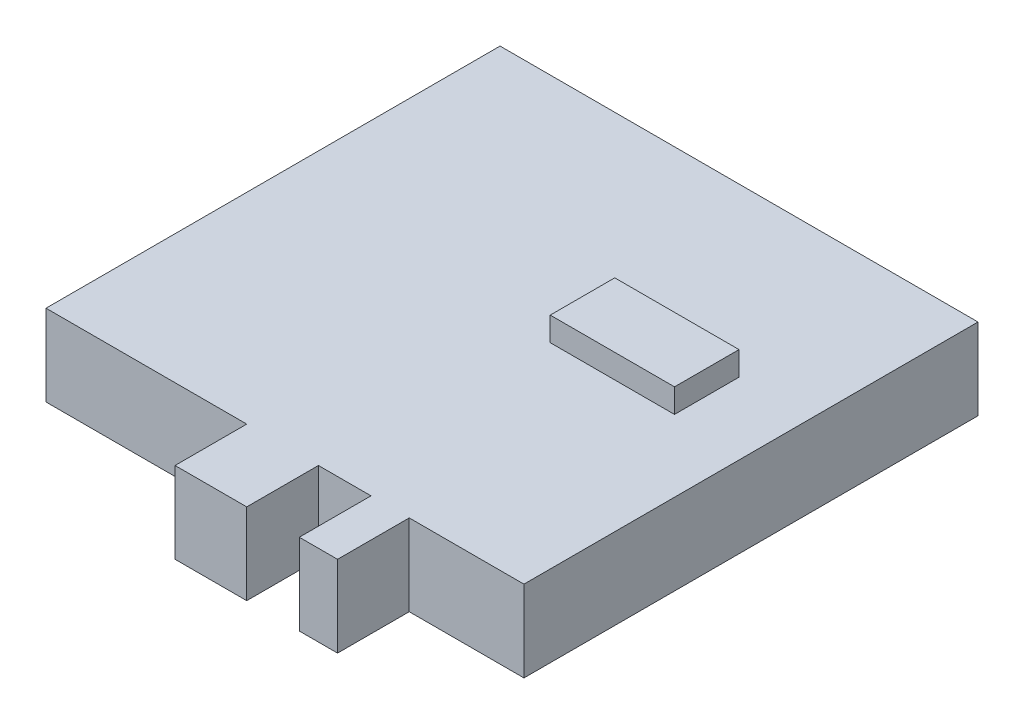
ISO-10303-21;
HEADER;
FILE_DESCRIPTION(('STEP AP214'),'2;1');
FILE_NAME('part.step','',(''),(''),'','','');
FILE_SCHEMA(('AUTOMOTIVE_DESIGN { 1 0 10303 214 1 1 1 1 }'));
ENDSEC;
DATA;
#1=APPLICATION_CONTEXT('core data for automotive mechanical design processes');
#2=APPLICATION_PROTOCOL_DEFINITION('international standard','automotive_design',2000,#1);
#3=PRODUCT_CONTEXT('',#1,'mechanical');
#4=PRODUCT('Part','Part','',(#3));
#5=PRODUCT_RELATED_PRODUCT_CATEGORY('part','',(#4));
#6=PRODUCT_DEFINITION_FORMATION('','',#4);
#7=PRODUCT_DEFINITION_CONTEXT('part definition',#1,'design');
#8=PRODUCT_DEFINITION('design','',#6,#7);
#9=PRODUCT_DEFINITION_SHAPE('','',#8);
#10=(LENGTH_UNIT() NAMED_UNIT(*) SI_UNIT(.MILLI.,.METRE.));
#11=(NAMED_UNIT(*) PLANE_ANGLE_UNIT() SI_UNIT($,.RADIAN.));
#12=(NAMED_UNIT(*) SI_UNIT($,.STERADIAN.) SOLID_ANGLE_UNIT());
#13=UNCERTAINTY_MEASURE_WITH_UNIT(LENGTH_MEASURE(1.E-05),#10,'distance_accuracy_value','');
#14=(GEOMETRIC_REPRESENTATION_CONTEXT(3) GLOBAL_UNCERTAINTY_ASSIGNED_CONTEXT((#13)) GLOBAL_UNIT_ASSIGNED_CONTEXT((#10,
#11,#12)) REPRESENTATION_CONTEXT('',''));
#15=CARTESIAN_POINT('',(0.,0.,0.));
#16=DIRECTION('',(0.,0.,1.));
#17=DIRECTION('',(1.,0.,0.));
#18=AXIS2_PLACEMENT_3D('',#15,#16,#17);
#19=CARTESIAN_POINT('',(0.,17.,0.));
#20=DIRECTION('',(0.,1.,0.));
#21=DIRECTION('',(0.,0.,1.));
#22=AXIS2_PLACEMENT_3D('',#19,#20,#21);
#23=PLANE('',#22);
#24=DIRECTION('',(0.,0.,1.));
#25=VECTOR('',#24,1.);
#26=CARTESIAN_POINT('',(43.9314666270869,17.,0.));
#27=LINE('',#26,#25);
#28=CARTESIAN_POINT('',(43.9314666270869,17.,43.414977660434));
#29=VERTEX_POINT('',#28);
#30=CARTESIAN_POINT('',(43.931466627087,17.,58.414977660434));
#31=VERTEX_POINT('',#30);
#32=EDGE_CURVE('E273',#29,#31,#27,.T.);
#33=ORIENTED_EDGE('',*,*,#32,.F.);
#34=DIRECTION('',(1.,0.,0.));
#35=VECTOR('',#34,1.);
#36=CARTESIAN_POINT('',(0.,17.,43.414977660434));
#37=LINE('',#36,#35);
#38=CARTESIAN_POINT('',(67.9314666270869,17.,43.414977660434));
#39=VERTEX_POINT('',#38);
#40=EDGE_CURVE('E290',#29,#39,#37,.T.);
#41=ORIENTED_EDGE('',*,*,#40,.T.);
#42=DIRECTION('',(0.,0.,1.));
#43=VECTOR('',#42,1.);
#44=CARTESIAN_POINT('',(67.9314666270869,17.,0.));
#45=LINE('',#44,#43);
#46=CARTESIAN_POINT('',(67.9314666270869,17.,-51.585022339566));
#47=VERTEX_POINT('',#46);
#48=EDGE_CURVE('E237',#47,#39,#45,.T.);
#49=ORIENTED_EDGE('',*,*,#48,.F.);
#50=DIRECTION('',(1.,0.,0.));
#51=VECTOR('',#50,1.);
#52=CARTESIAN_POINT('',(0.,17.,-51.585022339566));
#53=LINE('',#52,#51);
#54=CARTESIAN_POINT('',(-32.0685333729131,17.,-51.585022339566));
#55=VERTEX_POINT('',#54);
#56=EDGE_CURVE('E293',#55,#47,#53,.T.);
#57=ORIENTED_EDGE('',*,*,#56,.F.);
#58=DIRECTION('',(0.,0.,1.));
#59=VECTOR('',#58,1.);
#60=CARTESIAN_POINT('',(-32.0685333729131,17.,0.));
#61=LINE('',#60,#59);
#62=CARTESIAN_POINT('',(-32.0685333729131,17.,43.414977660434));
#63=VERTEX_POINT('',#62);
#64=EDGE_CURVE('E296',#55,#63,#61,.T.);
#65=ORIENTED_EDGE('',*,*,#64,.T.);
#66=DIRECTION('',(1.,0.,0.));
#67=VECTOR('',#66,1.);
#68=CARTESIAN_POINT('',(0.,17.,43.414977660434));
#69=LINE('',#68,#67);
#70=CARTESIAN_POINT('',(9.93146662708694,17.,43.414977660434));
#71=VERTEX_POINT('',#70);
#72=EDGE_CURVE('E299',#63,#71,#69,.T.);
#73=ORIENTED_EDGE('',*,*,#72,.T.);
#74=DIRECTION('',(0.,0.,1.));
#75=VECTOR('',#74,1.);
#76=CARTESIAN_POINT('',(9.93146662708694,17.,0.));
#77=LINE('',#76,#75);
#78=CARTESIAN_POINT('',(9.93146662708694,17.,58.414977660434));
#79=VERTEX_POINT('',#78);
#80=EDGE_CURVE('E302',#71,#79,#77,.T.);
#81=ORIENTED_EDGE('',*,*,#80,.T.);
#82=DIRECTION('',(1.,0.,0.));
#83=VECTOR('',#82,1.);
#84=CARTESIAN_POINT('',(0.,17.,58.414977660434));
#85=LINE('',#84,#83);
#86=CARTESIAN_POINT('',(24.9314666270869,17.,58.414977660434));
#87=VERTEX_POINT('',#86);
#88=EDGE_CURVE('E305',#79,#87,#85,.T.);
#89=ORIENTED_EDGE('',*,*,#88,.T.);
#90=DIRECTION('',(0.,0.,1.));
#91=VECTOR('',#90,1.);
#92=CARTESIAN_POINT('',(24.9314666270869,17.,0.));
#93=LINE('',#92,#91);
#94=CARTESIAN_POINT('',(24.9314666270869,17.,43.414977660434));
#95=VERTEX_POINT('',#94);
#96=EDGE_CURVE('E201',#95,#87,#93,.T.);
#97=ORIENTED_EDGE('',*,*,#96,.F.);
#98=DIRECTION('',(1.,0.,0.));
#99=VECTOR('',#98,1.);
#100=CARTESIAN_POINT('',(0.,17.,43.414977660434));
#101=LINE('',#100,#99);
#102=CARTESIAN_POINT('',(35.931466627087,17.,43.414977660434));
#103=VERTEX_POINT('',#102);
#104=EDGE_CURVE('E194',#95,#103,#101,.T.);
#105=ORIENTED_EDGE('',*,*,#104,.T.);
#106=DIRECTION('',(0.,0.,1.));
#107=VECTOR('',#106,1.);
#108=CARTESIAN_POINT('',(35.931466627087,17.,0.));
#109=LINE('',#108,#107);
#110=CARTESIAN_POINT('',(35.931466627087,17.,58.414977660434));
#111=VERTEX_POINT('',#110);
#112=EDGE_CURVE('E183',#103,#111,#109,.T.);
#113=ORIENTED_EDGE('',*,*,#112,.T.);
#114=DIRECTION('',(-1.,0.,0.));
#115=VECTOR('',#114,1.);
#116=CARTESIAN_POINT('',(0.,17.,58.414977660434));
#117=LINE('',#116,#115);
#118=EDGE_CURVE('E193',#31,#111,#117,.T.);
#119=ORIENTED_EDGE('',*,*,#118,.F.);
#120=EDGE_LOOP('',(#33,#41,#49,#57,#65,#73,#81,#89,#97,#105,#113,#119));
#121=FACE_BOUND('',#120,.T.);
#122=DIRECTION('',(1.,0.,0.));
#123=VECTOR('',#122,1.);
#124=CARTESIAN_POINT('',(26.9314666270869,17.,-3.08502233956596));
#125=LINE('',#124,#123);
#126=CARTESIAN_POINT('',(26.9314666270869,17.,-3.08502233956596));
#127=VERTEX_POINT('',#126);
#128=CARTESIAN_POINT('',(52.9314666270869,17.,-3.08502233956596));
#129=VERTEX_POINT('',#128);
#130=EDGE_CURVE('E349',#127,#129,#125,.T.);
#131=ORIENTED_EDGE('',*,*,#130,.F.);
#132=DIRECTION('',(0.,0.,1.));
#133=VECTOR('',#132,1.);
#134=CARTESIAN_POINT('',(26.9314666270869,17.,-16.585022339566));
#135=LINE('',#134,#133);
#136=CARTESIAN_POINT('',(26.9314666270869,17.,-16.585022339566));
#137=VERTEX_POINT('',#136);
#138=EDGE_CURVE('E340',#137,#127,#135,.T.);
#139=ORIENTED_EDGE('',*,*,#138,.F.);
#140=DIRECTION('',(-1.,0.,0.));
#141=VECTOR('',#140,1.);
#142=CARTESIAN_POINT('',(26.9314666270869,17.,-16.585022339566));
#143=LINE('',#142,#141);
#144=CARTESIAN_POINT('',(52.9314666270869,17.,-16.585022339566));
#145=VERTEX_POINT('',#144);
#146=EDGE_CURVE('E355',#145,#137,#143,.T.);
#147=ORIENTED_EDGE('',*,*,#146,.F.);
#148=DIRECTION('',(0.,0.,-1.));
#149=VECTOR('',#148,1.);
#150=CARTESIAN_POINT('',(52.9314666270869,17.,-16.585022339566));
#151=LINE('',#150,#149);
#152=EDGE_CURVE('E352',#129,#145,#151,.T.);
#153=ORIENTED_EDGE('',*,*,#152,.F.);
#154=EDGE_LOOP('',(#131,#139,#147,#153));
#155=FACE_BOUND('',#154,.T.);
#156=ADVANCED_FACE('F81',(#121,#155),#23,.T.);
#157=CARTESIAN_POINT('',(0.,17.,43.414977660434));
#158=DIRECTION('',(0.,0.,-1.));
#159=DIRECTION('',(-1.,0.,0.));
#160=AXIS2_PLACEMENT_3D('',#157,#158,#159);
#161=PLANE('',#160);
#162=DIRECTION('',(1.,0.,0.));
#163=VECTOR('',#162,1.);
#164=CARTESIAN_POINT('',(0.,0.,43.414977660434));
#165=LINE('',#164,#163);
#166=CARTESIAN_POINT('',(43.9314666270869,0.,43.414977660434));
#167=VERTEX_POINT('',#166);
#168=CARTESIAN_POINT('',(67.9314666270869,0.,43.414977660434));
#169=VERTEX_POINT('',#168);
#170=EDGE_CURVE('E240',#167,#169,#165,.T.);
#171=ORIENTED_EDGE('',*,*,#170,.T.);
#172=DIRECTION('',(0.,-1.,0.));
#173=VECTOR('',#172,1.);
#174=CARTESIAN_POINT('',(67.9314666270869,17.,43.414977660434));
#175=LINE('',#174,#173);
#176=EDGE_CURVE('E89',#39,#169,#175,.T.);
#177=ORIENTED_EDGE('',*,*,#176,.F.);
#178=ORIENTED_EDGE('',*,*,#40,.F.);
#179=DIRECTION('',(0.,-1.,0.));
#180=VECTOR('',#179,1.);
#181=CARTESIAN_POINT('',(43.9314666270869,17.,43.414977660434));
#182=LINE('',#181,#180);
#183=EDGE_CURVE('E12',#29,#167,#182,.T.);
#184=ORIENTED_EDGE('',*,*,#183,.T.);
#185=EDGE_LOOP('',(#171,#177,#178,#184));
#186=FACE_BOUND('',#185,.T.);
#187=ADVANCED_FACE('F241',(#186),#161,.F.);
#188=CARTESIAN_POINT('',(67.9314666270869,17.,0.));
#189=DIRECTION('',(1.,0.,0.));
#190=DIRECTION('',(0.,0.,-1.));
#191=AXIS2_PLACEMENT_3D('',#188,#189,#190);
#192=PLANE('',#191);
#193=DIRECTION('',(0.,0.,1.));
#194=VECTOR('',#193,1.);
#195=CARTESIAN_POINT('',(67.9314666270869,0.,0.));
#196=LINE('',#195,#194);
#197=CARTESIAN_POINT('',(67.9314666270869,0.,-51.585022339566));
#198=VERTEX_POINT('',#197);
#199=EDGE_CURVE('E234',#198,#169,#196,.T.);
#200=ORIENTED_EDGE('',*,*,#199,.F.);
#201=DIRECTION('',(0.,-1.,0.));
#202=VECTOR('',#201,1.);
#203=CARTESIAN_POINT('',(67.9314666270869,17.,-51.585022339566));
#204=LINE('',#203,#202);
#205=EDGE_CURVE('E226',#47,#198,#204,.T.);
#206=ORIENTED_EDGE('',*,*,#205,.F.);
#207=ORIENTED_EDGE('',*,*,#48,.T.);
#208=ORIENTED_EDGE('',*,*,#176,.T.);
#209=EDGE_LOOP('',(#200,#206,#207,#208));
#210=FACE_BOUND('',#209,.T.);
#211=ADVANCED_FACE('F232',(#210),#192,.T.);
#212=CARTESIAN_POINT('',(0.,17.,-51.585022339566));
#213=DIRECTION('',(0.,0.,-1.));
#214=DIRECTION('',(-1.,0.,0.));
#215=AXIS2_PLACEMENT_3D('',#212,#213,#214);
#216=PLANE('',#215);
#217=DIRECTION('',(1.,0.,0.));
#218=VECTOR('',#217,1.);
#219=CARTESIAN_POINT('',(0.,0.,-51.585022339566));
#220=LINE('',#219,#218);
#221=CARTESIAN_POINT('',(-32.0685333729131,0.,-51.585022339566));
#222=VERTEX_POINT('',#221);
#223=EDGE_CURVE('E248',#222,#198,#220,.T.);
#224=ORIENTED_EDGE('',*,*,#223,.F.);
#225=DIRECTION('',(0.,-1.,0.));
#226=VECTOR('',#225,1.);
#227=CARTESIAN_POINT('',(-32.0685333729131,17.,-51.585022339566));
#228=LINE('',#227,#226);
#229=EDGE_CURVE('E224',#55,#222,#228,.T.);
#230=ORIENTED_EDGE('',*,*,#229,.F.);
#231=ORIENTED_EDGE('',*,*,#56,.T.);
#232=ORIENTED_EDGE('',*,*,#205,.T.);
#233=EDGE_LOOP('',(#224,#230,#231,#232));
#234=FACE_BOUND('',#233,.T.);
#235=ADVANCED_FACE('F480',(#234),#216,.T.);
#236=CARTESIAN_POINT('',(-32.0685333729131,17.,0.));
#237=DIRECTION('',(1.,0.,0.));
#238=DIRECTION('',(0.,0.,-1.));
#239=AXIS2_PLACEMENT_3D('',#236,#237,#238);
#240=PLANE('',#239);
#241=DIRECTION('',(0.,0.,1.));
#242=VECTOR('',#241,1.);
#243=CARTESIAN_POINT('',(-32.0685333729131,0.,0.));
#244=LINE('',#243,#242);
#245=CARTESIAN_POINT('',(-32.0685333729131,0.,43.414977660434));
#246=VERTEX_POINT('',#245);
#247=EDGE_CURVE('E250',#222,#246,#244,.T.);
#248=ORIENTED_EDGE('',*,*,#247,.T.);
#249=DIRECTION('',(0.,-1.,0.));
#250=VECTOR('',#249,1.);
#251=CARTESIAN_POINT('',(-32.0685333729131,17.,43.414977660434));
#252=LINE('',#251,#250);
#253=EDGE_CURVE('E221',#63,#246,#252,.T.);
#254=ORIENTED_EDGE('',*,*,#253,.F.);
#255=ORIENTED_EDGE('',*,*,#64,.F.);
#256=ORIENTED_EDGE('',*,*,#229,.T.);
#257=EDGE_LOOP('',(#248,#254,#255,#256));
#258=FACE_BOUND('',#257,.T.);
#259=ADVANCED_FACE('F470',(#258),#240,.F.);
#260=CARTESIAN_POINT('',(0.,17.,43.414977660434));
#261=DIRECTION('',(0.,0.,-1.));
#262=DIRECTION('',(-1.,0.,0.));
#263=AXIS2_PLACEMENT_3D('',#260,#261,#262);
#264=PLANE('',#263);
#265=DIRECTION('',(1.,0.,0.));
#266=VECTOR('',#265,1.);
#267=CARTESIAN_POINT('',(0.,0.,43.414977660434));
#268=LINE('',#267,#266);
#269=CARTESIAN_POINT('',(9.93146662708694,0.,43.414977660434));
#270=VERTEX_POINT('',#269);
#271=EDGE_CURVE('E256',#246,#270,#268,.T.);
#272=ORIENTED_EDGE('',*,*,#271,.T.);
#273=DIRECTION('',(0.,-1.,0.));
#274=VECTOR('',#273,1.);
#275=CARTESIAN_POINT('',(9.93146662708694,17.,43.414977660434));
#276=LINE('',#275,#274);
#277=EDGE_CURVE('E218',#71,#270,#276,.T.);
#278=ORIENTED_EDGE('',*,*,#277,.F.);
#279=ORIENTED_EDGE('',*,*,#72,.F.);
#280=ORIENTED_EDGE('',*,*,#253,.T.);
#281=EDGE_LOOP('',(#272,#278,#279,#280));
#282=FACE_BOUND('',#281,.T.);
#283=ADVANCED_FACE('F460',(#282),#264,.F.);
#284=CARTESIAN_POINT('',(9.93146662708694,17.,0.));
#285=DIRECTION('',(1.,0.,0.));
#286=DIRECTION('',(0.,0.,-1.));
#287=AXIS2_PLACEMENT_3D('',#284,#285,#286);
#288=PLANE('',#287);
#289=DIRECTION('',(0.,0.,1.));
#290=VECTOR('',#289,1.);
#291=CARTESIAN_POINT('',(9.93146662708694,0.,0.));
#292=LINE('',#291,#290);
#293=CARTESIAN_POINT('',(9.93146662708694,0.,58.414977660434));
#294=VERTEX_POINT('',#293);
#295=EDGE_CURVE('E259',#270,#294,#292,.T.);
#296=ORIENTED_EDGE('',*,*,#295,.T.);
#297=DIRECTION('',(0.,-1.,0.));
#298=VECTOR('',#297,1.);
#299=CARTESIAN_POINT('',(9.93146662708694,17.,58.414977660434));
#300=LINE('',#299,#298);
#301=EDGE_CURVE('E215',#79,#294,#300,.T.);
#302=ORIENTED_EDGE('',*,*,#301,.F.);
#303=ORIENTED_EDGE('',*,*,#80,.F.);
#304=ORIENTED_EDGE('',*,*,#277,.T.);
#305=EDGE_LOOP('',(#296,#302,#303,#304));
#306=FACE_BOUND('',#305,.T.);
#307=ADVANCED_FACE('F450',(#306),#288,.F.);
#308=CARTESIAN_POINT('',(0.,17.,58.414977660434));
#309=DIRECTION('',(0.,0.,-1.));
#310=DIRECTION('',(-1.,0.,0.));
#311=AXIS2_PLACEMENT_3D('',#308,#309,#310);
#312=PLANE('',#311);
#313=DIRECTION('',(1.,0.,0.));
#314=VECTOR('',#313,1.);
#315=CARTESIAN_POINT('',(0.,0.,58.414977660434));
#316=LINE('',#315,#314);
#317=CARTESIAN_POINT('',(24.9314666270869,0.,58.414977660434));
#318=VERTEX_POINT('',#317);
#319=EDGE_CURVE('E262',#294,#318,#316,.T.);
#320=ORIENTED_EDGE('',*,*,#319,.T.);
#321=DIRECTION('',(0.,-1.,0.));
#322=VECTOR('',#321,1.);
#323=CARTESIAN_POINT('',(24.9314666270869,17.,58.414977660434));
#324=LINE('',#323,#322);
#325=EDGE_CURVE('E209',#87,#318,#324,.T.);
#326=ORIENTED_EDGE('',*,*,#325,.F.);
#327=ORIENTED_EDGE('',*,*,#88,.F.);
#328=ORIENTED_EDGE('',*,*,#301,.T.);
#329=EDGE_LOOP('',(#320,#326,#327,#328));
#330=FACE_BOUND('',#329,.T.);
#331=ADVANCED_FACE('F441',(#330),#312,.F.);
#332=CARTESIAN_POINT('',(24.9314666270869,17.,0.));
#333=DIRECTION('',(1.,0.,0.));
#334=DIRECTION('',(0.,0.,-1.));
#335=AXIS2_PLACEMENT_3D('',#332,#333,#334);
#336=PLANE('',#335);
#337=DIRECTION('',(0.,0.,1.));
#338=VECTOR('',#337,1.);
#339=CARTESIAN_POINT('',(24.9314666270869,0.,0.));
#340=LINE('',#339,#338);
#341=CARTESIAN_POINT('',(24.9314666270869,0.,43.414977660434));
#342=VERTEX_POINT('',#341);
#343=EDGE_CURVE('E265',#342,#318,#340,.T.);
#344=ORIENTED_EDGE('',*,*,#343,.F.);
#345=DIRECTION('',(0.,-1.,0.));
#346=VECTOR('',#345,1.);
#347=CARTESIAN_POINT('',(24.9314666270869,17.,43.414977660434));
#348=LINE('',#347,#346);
#349=EDGE_CURVE('E207',#95,#342,#348,.T.);
#350=ORIENTED_EDGE('',*,*,#349,.F.);
#351=ORIENTED_EDGE('',*,*,#96,.T.);
#352=ORIENTED_EDGE('',*,*,#325,.T.);
#353=EDGE_LOOP('',(#344,#350,#351,#352));
#354=FACE_BOUND('',#353,.T.);
#355=ADVANCED_FACE('F309',(#354),#336,.T.);
#356=CARTESIAN_POINT('',(0.,17.,43.414977660434));
#357=DIRECTION('',(0.,0.,-1.));
#358=DIRECTION('',(-1.,0.,0.));
#359=AXIS2_PLACEMENT_3D('',#356,#357,#358);
#360=PLANE('',#359);
#361=DIRECTION('',(1.,0.,0.));
#362=VECTOR('',#361,1.);
#363=CARTESIAN_POINT('',(0.,0.,43.414977660434));
#364=LINE('',#363,#362);
#365=CARTESIAN_POINT('',(35.931466627087,0.,43.414977660434));
#366=VERTEX_POINT('',#365);
#367=EDGE_CURVE('E206',#342,#366,#364,.T.);
#368=ORIENTED_EDGE('',*,*,#367,.T.);
#369=DIRECTION('',(0.,-1.,0.));
#370=VECTOR('',#369,1.);
#371=CARTESIAN_POINT('',(35.931466627087,17.,43.414977660434));
#372=LINE('',#371,#370);
#373=EDGE_CURVE('E188',#103,#366,#372,.T.);
#374=ORIENTED_EDGE('',*,*,#373,.F.);
#375=ORIENTED_EDGE('',*,*,#104,.F.);
#376=ORIENTED_EDGE('',*,*,#349,.T.);
#377=EDGE_LOOP('',(#368,#374,#375,#376));
#378=FACE_BOUND('',#377,.T.);
#379=ADVANCED_FACE('F204',(#378),#360,.F.);
#380=CARTESIAN_POINT('',(35.931466627087,17.,0.));
#381=DIRECTION('',(1.,0.,0.));
#382=DIRECTION('',(0.,0.,-1.));
#383=AXIS2_PLACEMENT_3D('',#380,#381,#382);
#384=PLANE('',#383);
#385=DIRECTION('',(0.,0.,1.));
#386=VECTOR('',#385,1.);
#387=CARTESIAN_POINT('',(35.931466627087,0.,0.));
#388=LINE('',#387,#386);
#389=CARTESIAN_POINT('',(35.931466627087,0.,58.414977660434));
#390=VERTEX_POINT('',#389);
#391=EDGE_CURVE('E269',#366,#390,#388,.T.);
#392=ORIENTED_EDGE('',*,*,#391,.T.);
#393=DIRECTION('',(0.,-1.,0.));
#394=VECTOR('',#393,1.);
#395=CARTESIAN_POINT('',(35.931466627087,17.,58.414977660434));
#396=LINE('',#395,#394);
#397=EDGE_CURVE('E190',#111,#390,#396,.T.);
#398=ORIENTED_EDGE('',*,*,#397,.F.);
#399=ORIENTED_EDGE('',*,*,#112,.F.);
#400=ORIENTED_EDGE('',*,*,#373,.T.);
#401=EDGE_LOOP('',(#392,#398,#399,#400));
#402=FACE_BOUND('',#401,.T.);
#403=ADVANCED_FACE('F186',(#402),#384,.F.);
#404=CARTESIAN_POINT('',(0.,17.,58.414977660434));
#405=DIRECTION('',(0.,0.,1.));
#406=DIRECTION('',(1.,0.,0.));
#407=AXIS2_PLACEMENT_3D('',#404,#405,#406);
#408=PLANE('',#407);
#409=DIRECTION('',(-1.,0.,0.));
#410=VECTOR('',#409,1.);
#411=CARTESIAN_POINT('',(0.,0.,58.414977660434));
#412=LINE('',#411,#410);
#413=CARTESIAN_POINT('',(43.931466627087,0.,58.414977660434));
#414=VERTEX_POINT('',#413);
#415=EDGE_CURVE('E271',#414,#390,#412,.T.);
#416=ORIENTED_EDGE('',*,*,#415,.F.);
#417=DIRECTION('',(0.,-1.,0.));
#418=VECTOR('',#417,1.);
#419=CARTESIAN_POINT('',(43.931466627087,17.,58.414977660434));
#420=LINE('',#419,#418);
#421=EDGE_CURVE('E105',#31,#414,#420,.T.);
#422=ORIENTED_EDGE('',*,*,#421,.F.);
#423=ORIENTED_EDGE('',*,*,#118,.T.);
#424=ORIENTED_EDGE('',*,*,#397,.T.);
#425=EDGE_LOOP('',(#416,#422,#423,#424));
#426=FACE_BOUND('',#425,.T.);
#427=ADVANCED_FACE('F311',(#426),#408,.T.);
#428=CARTESIAN_POINT('',(43.9314666270869,17.,0.));
#429=DIRECTION('',(1.,0.,0.));
#430=DIRECTION('',(0.,0.,-1.));
#431=AXIS2_PLACEMENT_3D('',#428,#429,#430);
#432=PLANE('',#431);
#433=DIRECTION('',(0.,0.,1.));
#434=VECTOR('',#433,1.);
#435=CARTESIAN_POINT('',(43.9314666270869,0.,0.));
#436=LINE('',#435,#434);
#437=EDGE_CURVE('E243',#167,#414,#436,.T.);
#438=ORIENTED_EDGE('',*,*,#437,.F.);
#439=ORIENTED_EDGE('',*,*,#183,.F.);
#440=ORIENTED_EDGE('',*,*,#32,.T.);
#441=ORIENTED_EDGE('',*,*,#421,.T.);
#442=EDGE_LOOP('',(#438,#439,#440,#441));
#443=FACE_BOUND('',#442,.T.);
#444=ADVANCED_FACE('F83',(#443),#432,.T.);
#445=CARTESIAN_POINT('',(0.,0.,0.));
#446=DIRECTION('',(0.,1.,0.));
#447=DIRECTION('',(0.,0.,1.));
#448=AXIS2_PLACEMENT_3D('',#445,#446,#447);
#449=PLANE('',#448);
#450=ORIENTED_EDGE('',*,*,#437,.T.);
#451=ORIENTED_EDGE('',*,*,#415,.T.);
#452=ORIENTED_EDGE('',*,*,#391,.F.);
#453=ORIENTED_EDGE('',*,*,#367,.F.);
#454=ORIENTED_EDGE('',*,*,#343,.T.);
#455=ORIENTED_EDGE('',*,*,#319,.F.);
#456=ORIENTED_EDGE('',*,*,#295,.F.);
#457=ORIENTED_EDGE('',*,*,#271,.F.);
#458=ORIENTED_EDGE('',*,*,#247,.F.);
#459=ORIENTED_EDGE('',*,*,#223,.T.);
#460=ORIENTED_EDGE('',*,*,#199,.T.);
#461=ORIENTED_EDGE('',*,*,#170,.F.);
#462=EDGE_LOOP('',(#450,#451,#452,#453,#454,#455,#456,#457,#458,#459,#460,#461));
#463=FACE_BOUND('',#462,.T.);
#464=ADVANCED_FACE('F245',(#463),#449,.F.);
#465=CARTESIAN_POINT('',(26.9314666270869,22.,-16.585022339566));
#466=DIRECTION('',(1.,0.,0.));
#467=DIRECTION('',(0.,0.,-1.));
#468=AXIS2_PLACEMENT_3D('',#465,#466,#467);
#469=PLANE('',#468);
#470=ORIENTED_EDGE('',*,*,#138,.T.);
#471=DIRECTION('',(0.,-1.,0.));
#472=VECTOR('',#471,1.);
#473=CARTESIAN_POINT('',(26.9314666270869,22.,-3.08502233956596));
#474=LINE('',#473,#472);
#475=CARTESIAN_POINT('',(26.9314666270869,22.,-3.08502233956596));
#476=VERTEX_POINT('',#475);
#477=EDGE_CURVE('E275',#476,#127,#474,.T.);
#478=ORIENTED_EDGE('',*,*,#477,.F.);
#479=DIRECTION('',(0.,0.,1.));
#480=VECTOR('',#479,1.);
#481=CARTESIAN_POINT('',(26.9314666270869,22.,-16.585022339566));
#482=LINE('',#481,#480);
#483=CARTESIAN_POINT('',(26.9314666270869,22.,-16.585022339566));
#484=VERTEX_POINT('',#483);
#485=EDGE_CURVE('E360',#484,#476,#482,.T.);
#486=ORIENTED_EDGE('',*,*,#485,.F.);
#487=DIRECTION('',(0.,-1.,0.));
#488=VECTOR('',#487,1.);
#489=CARTESIAN_POINT('',(26.9314666270869,22.,-16.585022339566));
#490=LINE('',#489,#488);
#491=EDGE_CURVE('E345',#484,#137,#490,.T.);
#492=ORIENTED_EDGE('',*,*,#491,.T.);
#493=EDGE_LOOP('',(#470,#478,#486,#492));
#494=FACE_BOUND('',#493,.T.);
#495=ADVANCED_FACE('F326',(#494),#469,.F.);
#496=CARTESIAN_POINT('',(26.9314666270869,22.,-3.08502233956596));
#497=DIRECTION('',(0.,0.,-1.));
#498=DIRECTION('',(-1.,0.,0.));
#499=AXIS2_PLACEMENT_3D('',#496,#497,#498);
#500=PLANE('',#499);
#501=ORIENTED_EDGE('',*,*,#130,.T.);
#502=DIRECTION('',(0.,-1.,0.));
#503=VECTOR('',#502,1.);
#504=CARTESIAN_POINT('',(52.9314666270869,22.,-3.08502233956596));
#505=LINE('',#504,#503);
#506=CARTESIAN_POINT('',(52.9314666270869,22.,-3.08502233956596));
#507=VERTEX_POINT('',#506);
#508=EDGE_CURVE('E277',#507,#129,#505,.T.);
#509=ORIENTED_EDGE('',*,*,#508,.F.);
#510=DIRECTION('',(1.,0.,0.));
#511=VECTOR('',#510,1.);
#512=CARTESIAN_POINT('',(26.9314666270869,22.,-3.08502233956596));
#513=LINE('',#512,#511);
#514=EDGE_CURVE('E367',#476,#507,#513,.T.);
#515=ORIENTED_EDGE('',*,*,#514,.F.);
#516=ORIENTED_EDGE('',*,*,#477,.T.);
#517=EDGE_LOOP('',(#501,#509,#515,#516));
#518=FACE_BOUND('',#517,.T.);
#519=ADVANCED_FACE('F332',(#518),#500,.F.);
#520=CARTESIAN_POINT('',(52.9314666270869,22.,-16.585022339566));
#521=DIRECTION('',(-1.,0.,0.));
#522=DIRECTION('',(0.,0.,1.));
#523=AXIS2_PLACEMENT_3D('',#520,#521,#522);
#524=PLANE('',#523);
#525=ORIENTED_EDGE('',*,*,#152,.T.);
#526=DIRECTION('',(0.,-1.,0.));
#527=VECTOR('',#526,1.);
#528=CARTESIAN_POINT('',(52.9314666270869,22.,-16.585022339566));
#529=LINE('',#528,#527);
#530=CARTESIAN_POINT('',(52.9314666270869,22.,-16.585022339566));
#531=VERTEX_POINT('',#530);
#532=EDGE_CURVE('E96',#531,#145,#529,.T.);
#533=ORIENTED_EDGE('',*,*,#532,.F.);
#534=DIRECTION('',(0.,0.,-1.));
#535=VECTOR('',#534,1.);
#536=CARTESIAN_POINT('',(52.9314666270869,22.,-16.585022339566));
#537=LINE('',#536,#535);
#538=EDGE_CURVE('E363',#507,#531,#537,.T.);
#539=ORIENTED_EDGE('',*,*,#538,.F.);
#540=ORIENTED_EDGE('',*,*,#508,.T.);
#541=EDGE_LOOP('',(#525,#533,#539,#540));
#542=FACE_BOUND('',#541,.T.);
#543=ADVANCED_FACE('F337',(#542),#524,.F.);
#544=CARTESIAN_POINT('',(26.9314666270869,22.,-16.585022339566));
#545=DIRECTION('',(0.,0.,1.));
#546=DIRECTION('',(1.,0.,0.));
#547=AXIS2_PLACEMENT_3D('',#544,#545,#546);
#548=PLANE('',#547);
#549=ORIENTED_EDGE('',*,*,#146,.T.);
#550=ORIENTED_EDGE('',*,*,#491,.F.);
#551=DIRECTION('',(-1.,0.,0.));
#552=VECTOR('',#551,1.);
#553=CARTESIAN_POINT('',(26.9314666270869,22.,-16.585022339566));
#554=LINE('',#553,#552);
#555=EDGE_CURVE('E361',#531,#484,#554,.T.);
#556=ORIENTED_EDGE('',*,*,#555,.F.);
#557=ORIENTED_EDGE('',*,*,#532,.T.);
#558=EDGE_LOOP('',(#549,#550,#556,#557));
#559=FACE_BOUND('',#558,.T.);
#560=ADVANCED_FACE('F379',(#559),#548,.F.);
#561=CARTESIAN_POINT('',(0.,22.,0.));
#562=DIRECTION('',(0.,1.,0.));
#563=DIRECTION('',(0.,0.,1.));
#564=AXIS2_PLACEMENT_3D('',#561,#562,#563);
#565=PLANE('',#564);
#566=ORIENTED_EDGE('',*,*,#485,.T.);
#567=ORIENTED_EDGE('',*,*,#514,.T.);
#568=ORIENTED_EDGE('',*,*,#538,.T.);
#569=ORIENTED_EDGE('',*,*,#555,.T.);
#570=EDGE_LOOP('',(#566,#567,#568,#569));
#571=FACE_BOUND('',#570,.T.);
#572=ADVANCED_FACE('F372',(#571),#565,.T.);
#573=CLOSED_SHELL('',(#156,#187,#211,#235,#259,#283,#307,#331,#355,#379,#403,#427,#444,#464,
#495,#519,#543,#560,#572));
#574=MANIFOLD_SOLID_BREP('B2',#573);
#575=ADVANCED_BREP_SHAPE_REPRESENTATION('',(#18,#574),#14);
#576=SHAPE_DEFINITION_REPRESENTATION(#9,#575);
ENDSEC;
END-ISO-10303-21;
